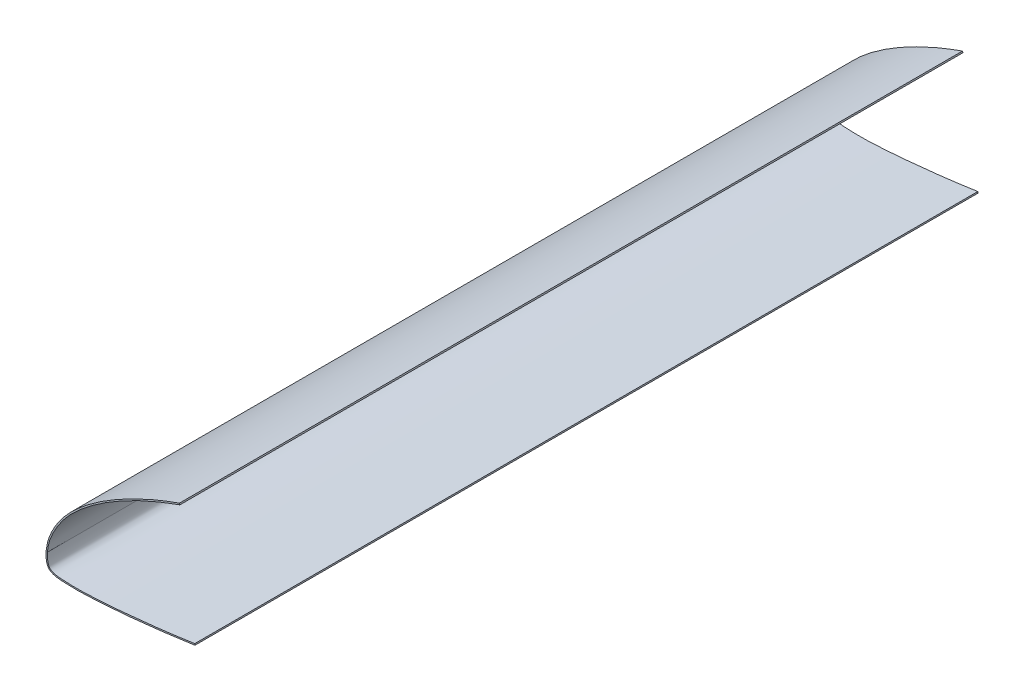
ISO-10303-21;
HEADER;
FILE_DESCRIPTION(('STEP AP214'),'2;1');
FILE_NAME('part.step','',(''),(''),'','','');
FILE_SCHEMA(('AUTOMOTIVE_DESIGN { 1 0 10303 214 1 1 1 1 }'));
ENDSEC;
DATA;
#1=APPLICATION_CONTEXT('core data for automotive mechanical design processes');
#2=APPLICATION_PROTOCOL_DEFINITION('international standard','automotive_design',2000,#1);
#3=PRODUCT_CONTEXT('',#1,'mechanical');
#4=PRODUCT('Part','Part','',(#3));
#5=PRODUCT_RELATED_PRODUCT_CATEGORY('part','',(#4));
#6=PRODUCT_DEFINITION_FORMATION('','',#4);
#7=PRODUCT_DEFINITION_CONTEXT('part definition',#1,'design');
#8=PRODUCT_DEFINITION('design','',#6,#7);
#9=PRODUCT_DEFINITION_SHAPE('','',#8);
#10=(LENGTH_UNIT() NAMED_UNIT(*) SI_UNIT(.MILLI.,.METRE.));
#11=(NAMED_UNIT(*) PLANE_ANGLE_UNIT() SI_UNIT($,.RADIAN.));
#12=(NAMED_UNIT(*) SI_UNIT($,.STERADIAN.) SOLID_ANGLE_UNIT());
#13=UNCERTAINTY_MEASURE_WITH_UNIT(LENGTH_MEASURE(1.E-05),#10,'distance_accuracy_value','');
#14=(GEOMETRIC_REPRESENTATION_CONTEXT(3) GLOBAL_UNCERTAINTY_ASSIGNED_CONTEXT((#13)) GLOBAL_UNIT_ASSIGNED_CONTEXT((#10,
#11,#12)) REPRESENTATION_CONTEXT('',''));
#15=CARTESIAN_POINT('',(0.,0.,0.));
#16=DIRECTION('',(0.,0.,1.));
#17=DIRECTION('',(1.,0.,0.));
#18=AXIS2_PLACEMENT_3D('',#15,#16,#17);
#19=CARTESIAN_POINT('',(98.7437628252059,347.380261796432,776.88119407791));
#20=CARTESIAN_POINT('',(98.7422980050507,346.898054724484,776.88119407791));
#21=CARTESIAN_POINT('',(98.7401200266492,345.927625566093,776.88119407791));
#22=CARTESIAN_POINT('',(98.7917793109112,344.508094864553,776.88119407791));
#23=CARTESIAN_POINT('',(98.9482617598731,343.092608986074,776.88119407791));
#24=CARTESIAN_POINT('',(99.2563920731665,341.698889753662,776.88119407791));
#25=CARTESIAN_POINT('',(99.7769498161651,340.510728532248,776.88119407791));
#26=CARTESIAN_POINT('',(100.800979936587,339.371721700969,776.88119407791));
#27=CARTESIAN_POINT('',(103.011322641727,338.411009889626,776.88119407791));
#28=CARTESIAN_POINT('',(105.771779497889,337.970600010428,776.88119407791));
#29=CARTESIAN_POINT('',(109.655593144662,337.810865158874,776.88119407791));
#30=CARTESIAN_POINT('',(114.563289728499,337.625021098452,776.88119407791));
#31=CARTESIAN_POINT('',(120.410585644608,337.710023245247,776.88119407791));
#32=CARTESIAN_POINT('',(126.286837549038,338.003371609977,776.88119407791));
#33=CARTESIAN_POINT('',(132.161038859743,338.36334403464,776.88119407791));
#34=CARTESIAN_POINT('',(138.029255706162,338.798885889907,776.88119407791));
#35=CARTESIAN_POINT('',(143.893347990875,339.304277983652,776.88119407791));
#36=CARTESIAN_POINT('',(151.707572955316,340.056460005603,776.88119407791));
#37=CARTESIAN_POINT('',(161.464836404735,341.116003815913,776.88119407791));
#38=CARTESIAN_POINT('',(173.158073701277,342.540277813056,776.88119407791));
#39=CARTESIAN_POINT('',(180.928818915454,343.629694574731,776.88119407791));
#40=CARTESIAN_POINT('',(184.807585519356,344.222837462633,776.88119407791));
#41=B_SPLINE_CURVE_WITH_KNOTS('',3,(#19,#20,#21,#22,#23,#24,#25,#26,#27,#28,#29,#30,#31,#32,#33,
#34,#35,#36,#37,#38,#39,#40),.UNSPECIFIED.,.F.,.F.,(4,1,1,1,1,1,1,1,1,1,1,1,1,1,1,1,1,1,1,4),
(8.78148493319208E-05,0.0024827826844769,0.00487775051962188,0.00727271835476686,
0.00966768618991181,0.0120626540250568,0.0144576218602018,0.0192475575304917,0.0240374932007817,
0.0288274288710717,0.0384073002116516,0.0479871715522315,0.0575670428928114,0.0671469142333913,
0.0767267855739712,0.0863066569145511,0.095886528255131,0.115046270936291,0.134206013617451,
0.15336575629861),.UNSPECIFIED.);
#42=DIRECTION('',(0.,0.,-1.));
#43=VECTOR('',#42,1.);
#44=SURFACE_OF_LINEAR_EXTRUSION('',#41,#43);
#45=CARTESIAN_POINT('',(98.7437628252059,347.380261796432,319.68119407791));
#46=CARTESIAN_POINT('',(98.7422980050507,346.898054724484,319.68119407791));
#47=CARTESIAN_POINT('',(98.7401200266492,345.927625566093,319.68119407791));
#48=CARTESIAN_POINT('',(98.7917793109112,344.508094864553,319.68119407791));
#49=CARTESIAN_POINT('',(98.9482617598731,343.092608986074,319.68119407791));
#50=CARTESIAN_POINT('',(99.2563920731665,341.698889753662,319.68119407791));
#51=CARTESIAN_POINT('',(99.7769498161651,340.510728532248,319.68119407791));
#52=CARTESIAN_POINT('',(100.800979936587,339.371721700969,319.68119407791));
#53=CARTESIAN_POINT('',(103.011322641727,338.411009889626,319.68119407791));
#54=CARTESIAN_POINT('',(105.771779497889,337.970600010428,319.68119407791));
#55=CARTESIAN_POINT('',(109.655593144662,337.810865158874,319.68119407791));
#56=CARTESIAN_POINT('',(114.563289728499,337.625021098452,319.68119407791));
#57=CARTESIAN_POINT('',(120.410585644608,337.710023245247,319.68119407791));
#58=CARTESIAN_POINT('',(126.286837549038,338.003371609977,319.68119407791));
#59=CARTESIAN_POINT('',(132.161038859743,338.36334403464,319.68119407791));
#60=CARTESIAN_POINT('',(138.029255706162,338.798885889907,319.68119407791));
#61=CARTESIAN_POINT('',(143.893347990875,339.304277983652,319.68119407791));
#62=CARTESIAN_POINT('',(151.707572955316,340.056460005603,319.68119407791));
#63=CARTESIAN_POINT('',(161.464836404735,341.116003815913,319.68119407791));
#64=CARTESIAN_POINT('',(173.158073701277,342.540277813056,319.68119407791));
#65=CARTESIAN_POINT('',(180.928818915454,343.629694574731,319.68119407791));
#66=CARTESIAN_POINT('',(184.807585519356,344.222837462633,319.68119407791));
#67=B_SPLINE_CURVE_WITH_KNOTS('',3,(#45,#46,#47,#48,#49,#50,#51,#52,#53,#54,#55,#56,#57,#58,#59,
#60,#61,#62,#63,#64,#65,#66),.UNSPECIFIED.,.F.,.F.,(4,1,1,1,1,1,1,1,1,1,1,1,1,1,1,1,1,1,1,4),
(8.78148493319208E-05,0.0024827826844769,0.00487775051962188,0.00727271835476686,
0.00966768618991181,0.0120626540250568,0.0144576218602018,0.0192475575304917,0.0240374932007817,
0.0288274288710717,0.0384073002116516,0.0479871715522315,0.0575670428928114,0.0671469142333913,
0.0767267855739712,0.0863066569145511,0.095886528255131,0.115046270936291,0.134206013617451,
0.15336575629861),.UNSPECIFIED.);
#68=CARTESIAN_POINT('',(98.7437628252059,347.380261796432,319.68119407791));
#69=VERTEX_POINT('',#68);
#70=CARTESIAN_POINT('',(184.807585519356,344.222837462633,319.68119407791));
#71=VERTEX_POINT('',#70);
#72=EDGE_CURVE('E148',#69,#71,#67,.T.);
#73=ORIENTED_EDGE('',*,*,#72,.F.);
#74=DIRECTION('',(0.,0.,-1.));
#75=VECTOR('',#74,1.);
#76=CARTESIAN_POINT('',(98.7437628252059,347.380261796432,776.88119407791));
#77=LINE('',#76,#75);
#78=CARTESIAN_POINT('',(98.7437628252059,347.380261796432,776.88119407791));
#79=VERTEX_POINT('',#78);
#80=EDGE_CURVE('E11',#79,#69,#77,.T.);
#81=ORIENTED_EDGE('',*,*,#80,.F.);
#82=CARTESIAN_POINT('',(184.807585519356,344.222837462633,776.88119407791));
#83=VERTEX_POINT('',#82);
#84=EDGE_CURVE('E155',#79,#83,#41,.T.);
#85=ORIENTED_EDGE('',*,*,#84,.T.);
#86=DIRECTION('',(0.,0.,-1.));
#87=VECTOR('',#86,1.);
#88=CARTESIAN_POINT('',(184.807585519356,344.222837462633,776.88119407791));
#89=LINE('',#88,#87);
#90=EDGE_CURVE('E37',#83,#71,#89,.T.);
#91=ORIENTED_EDGE('',*,*,#90,.T.);
#92=EDGE_LOOP('',(#73,#81,#85,#91));
#93=FACE_BOUND('',#92,.T.);
#94=ADVANCED_FACE('F33',(#93),#44,.T.);
#95=CARTESIAN_POINT('',(176.116818730647,410.028060684851,776.88119407791));
#96=CARTESIAN_POINT('',(167.905841345404,407.141501818076,776.88119407791));
#97=CARTESIAN_POINT('',(155.776686670866,402.21601316646,776.88119407791));
#98=CARTESIAN_POINT('',(140.314460750528,394.203435550606,776.88119407791));
#99=CARTESIAN_POINT('',(129.194692792799,387.373667920404,776.88119407791));
#100=CARTESIAN_POINT('',(120.469041894394,380.879227209986,776.88119407791));
#101=CARTESIAN_POINT('',(114.007117784805,375.102966208681,776.88119407791));
#102=CARTESIAN_POINT('',(109.553958472954,370.386106109129,776.88119407791));
#103=CARTESIAN_POINT('',(105.627816001466,365.230037823198,776.88119407791));
#104=CARTESIAN_POINT('',(102.887136936453,360.595560383616,776.88119407791));
#105=CARTESIAN_POINT('',(101.055954059282,356.6901873996,776.88119407791));
#106=CARTESIAN_POINT('',(99.9173545701997,353.684720681151,776.88119407791));
#107=CARTESIAN_POINT('',(99.1906811606964,350.619119090656,776.88119407791));
#108=CARTESIAN_POINT('',(98.892397355725,348.451909690076,776.88119407791));
#109=CARTESIAN_POINT('',(98.7437628252059,347.380261796432,776.88119407791));
#110=B_SPLINE_CURVE_WITH_KNOTS('',3,(#95,#96,#97,#98,#99,#100,#101,#102,#103,#104,#105,#106,
#107,#108,#109),.UNSPECIFIED.,.F.,.F.,(4,1,1,1,1,1,1,1,1,1,1,1,4),(0.836254434079234,
0.877169974918268,0.897627745337785,0.918085515757301,0.938543286176818,0.948772171386577,
0.959001056596335,0.969229941806093,0.979458827015852,0.984573269620731,0.98968771222561,
0.994802154830489,0.999916597435368),.UNSPECIFIED.);
#111=DIRECTION('',(0.,0.,-1.));
#112=VECTOR('',#111,1.);
#113=SURFACE_OF_LINEAR_EXTRUSION('',#110,#112);
#114=CARTESIAN_POINT('',(176.116818730647,410.028060684851,319.68119407791));
#115=CARTESIAN_POINT('',(167.905841345404,407.141501818076,319.68119407791));
#116=CARTESIAN_POINT('',(155.776686670866,402.21601316646,319.68119407791));
#117=CARTESIAN_POINT('',(140.314460750528,394.203435550606,319.68119407791));
#118=CARTESIAN_POINT('',(129.194692792799,387.373667920404,319.68119407791));
#119=CARTESIAN_POINT('',(120.469041894394,380.879227209986,319.68119407791));
#120=CARTESIAN_POINT('',(114.007117784805,375.102966208681,319.68119407791));
#121=CARTESIAN_POINT('',(109.553958472954,370.386106109129,319.68119407791));
#122=CARTESIAN_POINT('',(105.627816001466,365.230037823198,319.68119407791));
#123=CARTESIAN_POINT('',(102.887136936453,360.595560383616,319.68119407791));
#124=CARTESIAN_POINT('',(101.055954059282,356.6901873996,319.68119407791));
#125=CARTESIAN_POINT('',(99.9173545701997,353.684720681151,319.68119407791));
#126=CARTESIAN_POINT('',(99.1906811606964,350.619119090656,319.68119407791));
#127=CARTESIAN_POINT('',(98.892397355725,348.451909690076,319.68119407791));
#128=CARTESIAN_POINT('',(98.7437628252059,347.380261796432,319.68119407791));
#129=B_SPLINE_CURVE_WITH_KNOTS('',3,(#114,#115,#116,#117,#118,#119,#120,#121,#122,#123,#124,
#125,#126,#127,#128),.UNSPECIFIED.,.F.,.F.,(4,1,1,1,1,1,1,1,1,1,1,1,4),(0.836254434079234,
0.877169974918268,0.897627745337785,0.918085515757301,0.938543286176818,0.948772171386577,
0.959001056596335,0.969229941806093,0.979458827015852,0.984573269620731,0.98968771222561,
0.994802154830489,0.999916597435368),.UNSPECIFIED.);
#130=CARTESIAN_POINT('',(176.116818730647,410.028060684851,319.68119407791));
#131=VERTEX_POINT('',#130);
#132=EDGE_CURVE('E154',#131,#69,#129,.T.);
#133=ORIENTED_EDGE('',*,*,#132,.F.);
#134=DIRECTION('',(0.,0.,-1.));
#135=VECTOR('',#134,1.);
#136=CARTESIAN_POINT('',(176.116818730647,410.028060684851,776.88119407791));
#137=LINE('',#136,#135);
#138=CARTESIAN_POINT('',(176.116818730647,410.028060684851,776.88119407791));
#139=VERTEX_POINT('',#138);
#140=EDGE_CURVE('E43',#139,#131,#137,.T.);
#141=ORIENTED_EDGE('',*,*,#140,.F.);
#142=EDGE_CURVE('E109',#139,#79,#110,.T.);
#143=ORIENTED_EDGE('',*,*,#142,.T.);
#144=ORIENTED_EDGE('',*,*,#80,.T.);
#145=EDGE_LOOP('',(#133,#141,#143,#144));
#146=FACE_BOUND('',#145,.T.);
#147=ADVANCED_FACE('F143',(#146),#113,.T.);
#148=CARTESIAN_POINT('',(176.116818730647,410.028060684851,776.88119407791));
#149=DIRECTION('',(0.943401882873099,0.331651756201429,0.));
#150=DIRECTION('',(-0.331651756201429,0.943401882873099,0.));
#151=AXIS2_PLACEMENT_3D('',#148,#149,#150);
#152=PLANE('',#151);
#153=DIRECTION('',(0.331651756201429,-0.943401882873099,0.));
#154=VECTOR('',#153,1.);
#155=CARTESIAN_POINT('',(176.116818730647,410.028060684851,319.68119407791));
#156=LINE('',#155,#154);
#157=CARTESIAN_POINT('',(175.853570149162,410.776885929382,319.68119407791));
#158=VERTEX_POINT('',#157);
#159=EDGE_CURVE('E96',#158,#131,#156,.T.);
#160=ORIENTED_EDGE('',*,*,#159,.F.);
#161=DIRECTION('',(0.,0.,-1.));
#162=VECTOR('',#161,1.);
#163=CARTESIAN_POINT('',(175.853570149162,410.776885929382,776.88119407791));
#164=LINE('',#163,#162);
#165=CARTESIAN_POINT('',(175.853570149162,410.776885929382,776.88119407791));
#166=VERTEX_POINT('',#165);
#167=EDGE_CURVE('E91',#166,#158,#164,.T.);
#168=ORIENTED_EDGE('',*,*,#167,.F.);
#169=DIRECTION('',(0.331651756201429,-0.943401882873099,0.));
#170=VECTOR('',#169,1.);
#171=CARTESIAN_POINT('',(176.116818730647,410.028060684851,776.88119407791));
#172=LINE('',#171,#170);
#173=EDGE_CURVE('E94',#166,#139,#172,.T.);
#174=ORIENTED_EDGE('',*,*,#173,.T.);
#175=ORIENTED_EDGE('',*,*,#140,.T.);
#176=EDGE_LOOP('',(#160,#168,#174,#175));
#177=FACE_BOUND('',#176,.T.);
#178=ADVANCED_FACE('F93',(#177),#152,.T.);
#179=CARTESIAN_POINT('',(97.9501804164221,347.436261822211,776.88119407791));
#180=CARTESIAN_POINT('',(98.1005811276257,348.520263003881,776.88119407791));
#181=CARTESIAN_POINT('',(98.3971743164796,350.69535926874,776.88119407791));
#182=CARTESIAN_POINT('',(99.1425975482387,353.87526244718,776.88119407791));
#183=CARTESIAN_POINT('',(100.306877131679,356.959325428,776.88119407791));
#184=CARTESIAN_POINT('',(102.164200072022,360.929575002131,776.88119407791));
#185=CARTESIAN_POINT('',(104.943920279797,365.63919814977,776.88119407791));
#186=CARTESIAN_POINT('',(108.92237752307,370.871204813586,776.88119407791));
#187=CARTESIAN_POINT('',(113.428657001623,375.649260439105,776.88119407791));
#188=CARTESIAN_POINT('',(119.947374771748,381.480108265649,776.88119407791));
#189=CARTESIAN_POINT('',(128.728393564528,388.017974071972,776.88119407791));
#190=CARTESIAN_POINT('',(139.907274969035,394.886145621893,776.88119407791));
#191=CARTESIAN_POINT('',(155.440035217722,402.936502442955,776.88119407791));
#192=CARTESIAN_POINT('',(167.611094992672,407.879254060378,776.88119407791));
#193=CARTESIAN_POINT('',(175.853570149162,410.776885929382,776.88119407791));
#194=B_SPLINE_CURVE_WITH_KNOTS('',3,(#179,#180,#181,#182,#183,#184,#185,#186,#187,#188,#189,
#190,#191,#192,#193),.UNSPECIFIED.,.F.,.F.,(4,1,1,1,1,1,1,1,1,1,1,1,4),(0.836169969456757,
0.841287051581089,0.84640413370542,0.851521215829752,0.856638297954083,0.866872462202747,
0.87710662645141,0.887340790700073,0.897574954948736,0.918043283446062,0.938511611943389,
0.958979940440715,0.999916597435368),.UNSPECIFIED.);
#195=DIRECTION('',(0.,0.,-1.));
#196=VECTOR('',#195,1.);
#197=SURFACE_OF_LINEAR_EXTRUSION('',#194,#196);
#198=CARTESIAN_POINT('',(97.9501804164221,347.436261822211,319.68119407791));
#199=CARTESIAN_POINT('',(98.1005811276257,348.520263003881,319.68119407791));
#200=CARTESIAN_POINT('',(98.3971743164796,350.69535926874,319.68119407791));
#201=CARTESIAN_POINT('',(99.1425975482387,353.87526244718,319.68119407791));
#202=CARTESIAN_POINT('',(100.306877131679,356.959325428,319.68119407791));
#203=CARTESIAN_POINT('',(102.164200072022,360.929575002131,319.68119407791));
#204=CARTESIAN_POINT('',(104.943920279797,365.63919814977,319.68119407791));
#205=CARTESIAN_POINT('',(108.92237752307,370.871204813586,319.68119407791));
#206=CARTESIAN_POINT('',(113.428657001623,375.649260439105,319.68119407791));
#207=CARTESIAN_POINT('',(119.947374771748,381.480108265649,319.68119407791));
#208=CARTESIAN_POINT('',(128.728393564528,388.017974071972,319.68119407791));
#209=CARTESIAN_POINT('',(139.907274969035,394.886145621893,319.68119407791));
#210=CARTESIAN_POINT('',(155.440035217722,402.936502442955,319.68119407791));
#211=CARTESIAN_POINT('',(167.611094992672,407.879254060378,319.68119407791));
#212=CARTESIAN_POINT('',(175.853570149162,410.776885929382,319.68119407791));
#213=B_SPLINE_CURVE_WITH_KNOTS('',3,(#198,#199,#200,#201,#202,#203,#204,#205,#206,#207,#208,
#209,#210,#211,#212),.UNSPECIFIED.,.F.,.F.,(4,1,1,1,1,1,1,1,1,1,1,1,4),(0.836169969456757,
0.841287051581089,0.84640413370542,0.851521215829752,0.856638297954083,0.866872462202747,
0.87710662645141,0.887340790700073,0.897574954948736,0.918043283446062,0.938511611943389,
0.958979940440715,0.999916597435368),.UNSPECIFIED.);
#214=CARTESIAN_POINT('',(97.9501804164222,347.436261822212,319.68119407791));
#215=VERTEX_POINT('',#214);
#216=EDGE_CURVE('E157',#215,#158,#213,.T.);
#217=ORIENTED_EDGE('',*,*,#216,.F.);
#218=DIRECTION('',(0.,0.,-1.));
#219=VECTOR('',#218,1.);
#220=CARTESIAN_POINT('',(97.9501804164222,347.436261822212,776.88119407791));
#221=LINE('',#220,#219);
#222=CARTESIAN_POINT('',(97.9501804164222,347.436261822212,776.88119407791));
#223=VERTEX_POINT('',#222);
#224=EDGE_CURVE('E101',#223,#215,#221,.T.);
#225=ORIENTED_EDGE('',*,*,#224,.F.);
#226=EDGE_CURVE('E107',#223,#166,#194,.T.);
#227=ORIENTED_EDGE('',*,*,#226,.T.);
#228=ORIENTED_EDGE('',*,*,#167,.T.);
#229=EDGE_LOOP('',(#217,#225,#227,#228));
#230=FACE_BOUND('',#229,.T.);
#231=ADVANCED_FACE('F111',(#230),#197,.T.);
#232=CARTESIAN_POINT('',(184.927571350196,343.438208593104,776.88119407791));
#233=CARTESIAN_POINT('',(181.040933484876,342.843862028053,776.88119407791));
#234=CARTESIAN_POINT('',(173.253081525646,341.752110108422,776.88119407791));
#235=CARTESIAN_POINT('',(161.542083062636,340.325860567863,776.88119407791));
#236=CARTESIAN_POINT('',(151.770183409677,339.264902880306,776.88119407791));
#237=CARTESIAN_POINT('',(143.941912164157,338.511632739158,776.88119407791));
#238=CARTESIAN_POINT('',(138.065867745,338.005476287631,776.88119407791));
#239=CARTESIAN_POINT('',(132.183559819169,337.569286594011,776.88119407791));
#240=CARTESIAN_POINT('',(126.298268743476,337.208958243345,776.88119407791));
#241=CARTESIAN_POINT('',(120.402425752862,336.915226123005,776.88119407791));
#242=CARTESIAN_POINT('',(115.494718924261,336.845343616417,776.88119407791));
#243=CARTESIAN_POINT('',(111.54680790546,336.944791730827,776.88119407791));
#244=CARTESIAN_POINT('',(108.61476021274,337.059162870304,776.88119407791));
#245=CARTESIAN_POINT('',(105.668551650775,337.180770052791,776.88119407791));
#246=CARTESIAN_POINT('',(103.237718239627,337.571697676073,776.88119407791));
#247=CARTESIAN_POINT('',(101.313088235181,338.281485887087,776.88119407791));
#248=CARTESIAN_POINT('',(100.017793573851,339.04220266421,776.88119407791));
#249=CARTESIAN_POINT('',(99.0569141617431,340.136986868291,776.88119407791));
#250=CARTESIAN_POINT('',(98.4773758871061,341.521164247498,776.88119407791));
#251=CARTESIAN_POINT('',(98.154490297628,343.021943609187,776.88119407791));
#252=CARTESIAN_POINT('',(97.9427356467327,345.001594157075,776.88119407791));
#253=CARTESIAN_POINT('',(97.9471766652926,346.458477939775,776.88119407791));
#254=CARTESIAN_POINT('',(97.9501804164222,347.436261822212,776.88119407791));
#255=B_SPLINE_CURVE_WITH_KNOTS('',3,(#232,#233,#234,#235,#236,#237,#238,#239,#240,#241,#242,
#243,#244,#245,#246,#247,#248,#249,#250,#251,#252,#253,#254),.UNSPECIFIED.,.F.,.F.,(4,1,1,1,1,1,
1,1,1,1,1,1,1,1,1,1,1,1,1,1,4),(8.78148493324327E-05,0.0192586444976578,0.0384294741459832,
0.0576003037943086,0.0671857186184713,0.076771133442634,0.0863565482667967,0.0959419630909594,
0.105527377915122,0.115112792739285,0.119905500151366,0.124698207563447,0.129490914975529,
0.13428362238761,0.136679976093651,0.139076329799692,0.141472683505732,0.143869037211773,
0.146265390917814,0.148661744623854,0.153454452035936),.UNSPECIFIED.);
#256=DIRECTION('',(0.,0.,-1.));
#257=VECTOR('',#256,1.);
#258=SURFACE_OF_LINEAR_EXTRUSION('',#255,#257);
#259=CARTESIAN_POINT('',(184.927571350196,343.438208593104,319.68119407791));
#260=CARTESIAN_POINT('',(181.040933484876,342.843862028053,319.68119407791));
#261=CARTESIAN_POINT('',(173.253081525646,341.752110108422,319.68119407791));
#262=CARTESIAN_POINT('',(161.542083062636,340.325860567863,319.68119407791));
#263=CARTESIAN_POINT('',(151.770183409677,339.264902880306,319.68119407791));
#264=CARTESIAN_POINT('',(143.941912164157,338.511632739158,319.68119407791));
#265=CARTESIAN_POINT('',(138.065867745,338.005476287631,319.68119407791));
#266=CARTESIAN_POINT('',(132.183559819169,337.569286594011,319.68119407791));
#267=CARTESIAN_POINT('',(126.298268743476,337.208958243345,319.68119407791));
#268=CARTESIAN_POINT('',(120.402425752862,336.915226123005,319.68119407791));
#269=CARTESIAN_POINT('',(115.494718924261,336.845343616417,319.68119407791));
#270=CARTESIAN_POINT('',(111.54680790546,336.944791730827,319.68119407791));
#271=CARTESIAN_POINT('',(108.61476021274,337.059162870304,319.68119407791));
#272=CARTESIAN_POINT('',(105.668551650775,337.180770052791,319.68119407791));
#273=CARTESIAN_POINT('',(103.237718239627,337.571697676073,319.68119407791));
#274=CARTESIAN_POINT('',(101.313088235181,338.281485887087,319.68119407791));
#275=CARTESIAN_POINT('',(100.017793573851,339.04220266421,319.68119407791));
#276=CARTESIAN_POINT('',(99.0569141617431,340.136986868291,319.68119407791));
#277=CARTESIAN_POINT('',(98.4773758871061,341.521164247498,319.68119407791));
#278=CARTESIAN_POINT('',(98.154490297628,343.021943609187,319.68119407791));
#279=CARTESIAN_POINT('',(97.9427356467327,345.001594157075,319.68119407791));
#280=CARTESIAN_POINT('',(97.9471766652926,346.458477939775,319.68119407791));
#281=CARTESIAN_POINT('',(97.9501804164222,347.436261822212,319.68119407791));
#282=B_SPLINE_CURVE_WITH_KNOTS('',3,(#259,#260,#261,#262,#263,#264,#265,#266,#267,#268,#269,
#270,#271,#272,#273,#274,#275,#276,#277,#278,#279,#280,#281),.UNSPECIFIED.,.F.,.F.,(4,1,1,1,1,1,
1,1,1,1,1,1,1,1,1,1,1,1,1,1,4),(8.78148493324327E-05,0.0192586444976578,0.0384294741459832,
0.0576003037943086,0.0671857186184713,0.076771133442634,0.0863565482667967,0.0959419630909594,
0.105527377915122,0.115112792739285,0.119905500151366,0.124698207563447,0.129490914975529,
0.13428362238761,0.136679976093651,0.139076329799692,0.141472683505732,0.143869037211773,
0.146265390917814,0.148661744623854,0.153454452035936),.UNSPECIFIED.);
#283=CARTESIAN_POINT('',(184.927571350196,343.438208593104,319.68119407791));
#284=VERTEX_POINT('',#283);
#285=EDGE_CURVE('E229',#284,#215,#282,.T.);
#286=ORIENTED_EDGE('',*,*,#285,.F.);
#287=DIRECTION('',(0.,0.,-1.));
#288=VECTOR('',#287,1.);
#289=CARTESIAN_POINT('',(184.927571350196,343.438208593104,776.88119407791));
#290=LINE('',#289,#288);
#291=CARTESIAN_POINT('',(184.927571350196,343.438208593104,776.88119407791));
#292=VERTEX_POINT('',#291);
#293=EDGE_CURVE('E167',#292,#284,#290,.T.);
#294=ORIENTED_EDGE('',*,*,#293,.F.);
#295=EDGE_CURVE('E112',#292,#223,#255,.T.);
#296=ORIENTED_EDGE('',*,*,#295,.T.);
#297=ORIENTED_EDGE('',*,*,#224,.T.);
#298=EDGE_LOOP('',(#286,#294,#296,#297));
#299=FACE_BOUND('',#298,.T.);
#300=ADVANCED_FACE('F131',(#299),#258,.T.);
#301=CARTESIAN_POINT('',(184.807585519356,344.222837462633,776.88119407791));
#302=DIRECTION('',(0.988508812004514,0.151163251451618,0.));
#303=DIRECTION('',(-0.151163251451618,0.988508812004514,0.));
#304=AXIS2_PLACEMENT_3D('',#301,#302,#303);
#305=PLANE('',#304);
#306=DIRECTION('',(0.151163251451618,-0.988508812004514,0.));
#307=VECTOR('',#306,1.);
#308=CARTESIAN_POINT('',(184.807585519356,344.222837462633,319.68119407791));
#309=LINE('',#308,#307);
#310=EDGE_CURVE('E152',#71,#284,#309,.T.);
#311=ORIENTED_EDGE('',*,*,#310,.F.);
#312=ORIENTED_EDGE('',*,*,#90,.F.);
#313=DIRECTION('',(0.151163251451618,-0.988508812004514,0.));
#314=VECTOR('',#313,1.);
#315=CARTESIAN_POINT('',(184.807585519356,344.222837462633,776.88119407791));
#316=LINE('',#315,#314);
#317=EDGE_CURVE('E114',#83,#292,#316,.T.);
#318=ORIENTED_EDGE('',*,*,#317,.T.);
#319=ORIENTED_EDGE('',*,*,#293,.T.);
#320=EDGE_LOOP('',(#311,#312,#318,#319));
#321=FACE_BOUND('',#320,.T.);
#322=ADVANCED_FACE('F134',(#321),#305,.T.);
#323=CARTESIAN_POINT('',(138.028568279211,338.81052759632,776.88119407791));
#324=DIRECTION('',(0.,0.,1.));
#325=DIRECTION('',(1.,0.,0.));
#326=AXIS2_PLACEMENT_3D('',#323,#324,#325);
#327=PLANE('',#326);
#328=ORIENTED_EDGE('',*,*,#84,.F.);
#329=ORIENTED_EDGE('',*,*,#142,.F.);
#330=ORIENTED_EDGE('',*,*,#173,.F.);
#331=ORIENTED_EDGE('',*,*,#226,.F.);
#332=ORIENTED_EDGE('',*,*,#295,.F.);
#333=ORIENTED_EDGE('',*,*,#317,.F.);
#334=EDGE_LOOP('',(#328,#329,#330,#331,#332,#333));
#335=FACE_BOUND('',#334,.T.);
#336=ADVANCED_FACE('F105',(#335),#327,.T.);
#337=CARTESIAN_POINT('',(138.028568279211,338.81052759632,319.68119407791));
#338=DIRECTION('',(0.,0.,1.));
#339=DIRECTION('',(1.,0.,0.));
#340=AXIS2_PLACEMENT_3D('',#337,#338,#339);
#341=PLANE('',#340);
#342=ORIENTED_EDGE('',*,*,#72,.T.);
#343=ORIENTED_EDGE('',*,*,#310,.T.);
#344=ORIENTED_EDGE('',*,*,#285,.T.);
#345=ORIENTED_EDGE('',*,*,#216,.T.);
#346=ORIENTED_EDGE('',*,*,#159,.T.);
#347=ORIENTED_EDGE('',*,*,#132,.T.);
#348=EDGE_LOOP('',(#342,#343,#344,#345,#346,#347));
#349=FACE_BOUND('',#348,.T.);
#350=ADVANCED_FACE('F140',(#349),#341,.F.);
#351=CLOSED_SHELL('',(#94,#147,#178,#231,#300,#322,#336,#350));
#352=MANIFOLD_SOLID_BREP('B2',#351);
#353=ADVANCED_BREP_SHAPE_REPRESENTATION('',(#18,#352),#14);
#354=SHAPE_DEFINITION_REPRESENTATION(#9,#353);
ENDSEC;
END-ISO-10303-21;
